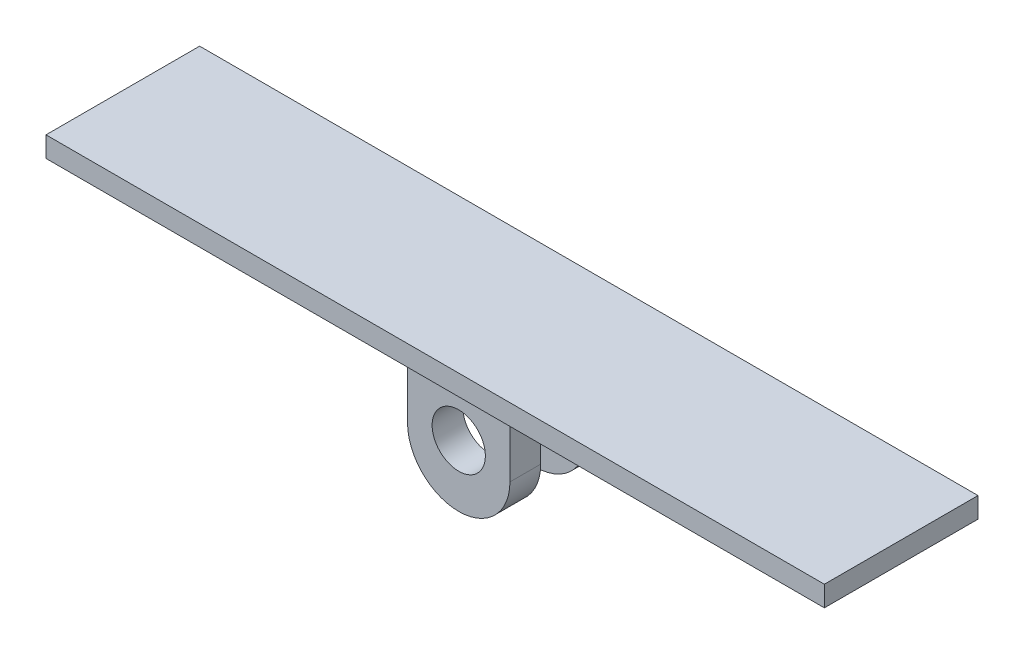
ISO-10303-21;
HEADER;
FILE_DESCRIPTION(('STEP AP214'),'2;1');
FILE_NAME('part.step','',(''),(''),'','','');
FILE_SCHEMA(('AUTOMOTIVE_DESIGN { 1 0 10303 214 1 1 1 1 }'));
ENDSEC;
DATA;
#1=APPLICATION_CONTEXT('core data for automotive mechanical design processes');
#2=APPLICATION_PROTOCOL_DEFINITION('international standard','automotive_design',2000,#1);
#3=PRODUCT_CONTEXT('',#1,'mechanical');
#4=PRODUCT('Part','Part','',(#3));
#5=PRODUCT_RELATED_PRODUCT_CATEGORY('part','',(#4));
#6=PRODUCT_DEFINITION_FORMATION('','',#4);
#7=PRODUCT_DEFINITION_CONTEXT('part definition',#1,'design');
#8=PRODUCT_DEFINITION('design','',#6,#7);
#9=PRODUCT_DEFINITION_SHAPE('','',#8);
#10=(LENGTH_UNIT() NAMED_UNIT(*) SI_UNIT(.MILLI.,.METRE.));
#11=(NAMED_UNIT(*) PLANE_ANGLE_UNIT() SI_UNIT($,.RADIAN.));
#12=(NAMED_UNIT(*) SI_UNIT($,.STERADIAN.) SOLID_ANGLE_UNIT());
#13=UNCERTAINTY_MEASURE_WITH_UNIT(LENGTH_MEASURE(1.E-05),#10,'distance_accuracy_value','');
#14=(GEOMETRIC_REPRESENTATION_CONTEXT(3) GLOBAL_UNCERTAINTY_ASSIGNED_CONTEXT((#13)) GLOBAL_UNIT_ASSIGNED_CONTEXT((#10,
#11,#12)) REPRESENTATION_CONTEXT('',''));
#15=CARTESIAN_POINT('',(0.,0.,0.));
#16=DIRECTION('',(0.,0.,1.));
#17=DIRECTION('',(1.,0.,0.));
#18=AXIS2_PLACEMENT_3D('',#15,#16,#17);
#19=CARTESIAN_POINT('',(-26.6,-1.06140576327071,-12.7528213648522));
#20=DIRECTION('',(0.,-1.,0.));
#21=DIRECTION('',(1.,0.,0.));
#22=AXIS2_PLACEMENT_3D('',#19,#20,#21);
#23=PLANE('',#22);
#24=DIRECTION('',(1.,0.,0.));
#25=VECTOR('',#24,1.);
#26=CARTESIAN_POINT('',(-26.6,-1.06140576327071,-2.25282136485218));
#27=LINE('',#26,#25);
#28=CARTESIAN_POINT('',(-26.6,-1.06140576327071,-2.25282136485218));
#29=VERTEX_POINT('',#28);
#30=CARTESIAN_POINT('',(26.6,-1.0614057632707,-2.25282136485218));
#31=VERTEX_POINT('',#30);
#32=EDGE_CURVE('E215',#29,#31,#27,.T.);
#33=ORIENTED_EDGE('',*,*,#32,.F.);
#34=DIRECTION('',(0.,0.,1.));
#35=VECTOR('',#34,1.);
#36=CARTESIAN_POINT('',(-26.6,-1.06140576327071,-12.7528213648522));
#37=LINE('',#36,#35);
#38=CARTESIAN_POINT('',(-26.6,-1.06140576327071,-12.7528213648522));
#39=VERTEX_POINT('',#38);
#40=EDGE_CURVE('E225',#39,#29,#37,.T.);
#41=ORIENTED_EDGE('',*,*,#40,.F.);
#42=DIRECTION('',(1.,0.,0.));
#43=VECTOR('',#42,1.);
#44=CARTESIAN_POINT('',(-26.6,-1.06140576327071,-12.7528213648522));
#45=LINE('',#44,#43);
#46=CARTESIAN_POINT('',(26.6,-1.0614057632707,-12.7528213648522));
#47=VERTEX_POINT('',#46);
#48=EDGE_CURVE('E203',#39,#47,#45,.T.);
#49=ORIENTED_EDGE('',*,*,#48,.T.);
#50=DIRECTION('',(0.,0.,1.));
#51=VECTOR('',#50,1.);
#52=CARTESIAN_POINT('',(26.6,-1.0614057632707,-12.7528213648522));
#53=LINE('',#52,#51);
#54=EDGE_CURVE('E223',#47,#31,#53,.T.);
#55=ORIENTED_EDGE('',*,*,#54,.T.);
#56=EDGE_LOOP('',(#33,#41,#49,#55));
#57=FACE_BOUND('',#56,.T.);
#58=DIRECTION('',(-1.,0.,0.));
#59=VECTOR('',#58,1.);
#60=CARTESIAN_POINT('',(-3.49999999999999,-1.06140576327071,-9.11282136485218));
#61=LINE('',#60,#59);
#62=CARTESIAN_POINT('',(3.50000000000001,-1.06140576327071,-9.11282136485218));
#63=VERTEX_POINT('',#62);
#64=CARTESIAN_POINT('',(-3.49999999999999,-1.06140576327071,-9.11282136485218));
#65=VERTEX_POINT('',#64);
#66=EDGE_CURVE('E191',#63,#65,#61,.T.);
#67=ORIENTED_EDGE('',*,*,#66,.F.);
#68=DIRECTION('',(0.,0.,1.));
#69=VECTOR('',#68,1.);
#70=CARTESIAN_POINT('',(3.50000000000001,-1.06140576327071,-9.11282136485218));
#71=LINE('',#70,#69);
#72=CARTESIAN_POINT('',(3.50000000000001,-1.06140576327071,-11.2128213648522));
#73=VERTEX_POINT('',#72);
#74=EDGE_CURVE('E162',#73,#63,#71,.T.);
#75=ORIENTED_EDGE('',*,*,#74,.F.);
#76=DIRECTION('',(1.,0.,0.));
#77=VECTOR('',#76,1.);
#78=CARTESIAN_POINT('',(-3.49999999999999,-1.06140576327071,-11.2128213648522));
#79=LINE('',#78,#77);
#80=CARTESIAN_POINT('',(-3.49999999999999,-1.06140576327071,-11.2128213648522));
#81=VERTEX_POINT('',#80);
#82=EDGE_CURVE('E185',#81,#73,#79,.T.);
#83=ORIENTED_EDGE('',*,*,#82,.F.);
#84=DIRECTION('',(0.,0.,-1.));
#85=VECTOR('',#84,1.);
#86=CARTESIAN_POINT('',(-3.49999999999999,-1.06140576327071,-9.11282136485218));
#87=LINE('',#86,#85);
#88=EDGE_CURVE('E188',#65,#81,#87,.T.);
#89=ORIENTED_EDGE('',*,*,#88,.F.);
#90=EDGE_LOOP('',(#67,#75,#83,#89));
#91=FACE_BOUND('',#90,.T.);
#92=DIRECTION('',(-1.,0.,0.));
#93=VECTOR('',#92,1.);
#94=CARTESIAN_POINT('',(-3.49999999999999,-1.06140576327071,-3.86282136485218));
#95=LINE('',#94,#93);
#96=CARTESIAN_POINT('',(3.50000000000001,-1.06140576327071,-3.86282136485218));
#97=VERTEX_POINT('',#96);
#98=CARTESIAN_POINT('',(-3.49999999999999,-1.06140576327071,-3.86282136485218));
#99=VERTEX_POINT('',#98);
#100=EDGE_CURVE('E145',#97,#99,#95,.T.);
#101=ORIENTED_EDGE('',*,*,#100,.F.);
#102=DIRECTION('',(0.,0.,1.));
#103=VECTOR('',#102,1.);
#104=CARTESIAN_POINT('',(3.50000000000001,-1.06140576327071,-3.86282136485218));
#105=LINE('',#104,#103);
#106=CARTESIAN_POINT('',(3.5,-1.06140576327071,-5.96282136485218));
#107=VERTEX_POINT('',#106);
#108=EDGE_CURVE('E156',#107,#97,#105,.T.);
#109=ORIENTED_EDGE('',*,*,#108,.F.);
#110=DIRECTION('',(1.,0.,0.));
#111=VECTOR('',#110,1.);
#112=CARTESIAN_POINT('',(-3.5,-1.06140576327071,-5.96282136485218));
#113=LINE('',#112,#111);
#114=CARTESIAN_POINT('',(-3.5,-1.06140576327071,-5.96282136485218));
#115=VERTEX_POINT('',#114);
#116=EDGE_CURVE('E167',#115,#107,#113,.T.);
#117=ORIENTED_EDGE('',*,*,#116,.F.);
#118=DIRECTION('',(0.,0.,-1.));
#119=VECTOR('',#118,1.);
#120=CARTESIAN_POINT('',(-3.49999999999999,-1.06140576327071,-3.86282136485218));
#121=LINE('',#120,#119);
#122=EDGE_CURVE('E165',#99,#115,#121,.T.);
#123=ORIENTED_EDGE('',*,*,#122,.F.);
#124=EDGE_LOOP('',(#101,#109,#117,#123));
#125=FACE_BOUND('',#124,.T.);
#126=ADVANCED_FACE('F41',(#57,#91,#125),#23,.T.);
#127=CARTESIAN_POINT('',(-26.6,0.338594236729289,-12.7528213648522));
#128=DIRECTION('',(0.,1.,0.));
#129=DIRECTION('',(-1.,0.,0.));
#130=AXIS2_PLACEMENT_3D('',#127,#128,#129);
#131=PLANE('',#130);
#132=DIRECTION('',(-1.,0.,0.));
#133=VECTOR('',#132,1.);
#134=CARTESIAN_POINT('',(-26.6,0.338594236729289,-2.25282136485218));
#135=LINE('',#134,#133);
#136=CARTESIAN_POINT('',(26.6,0.338594236729295,-2.25282136485218));
#137=VERTEX_POINT('',#136);
#138=CARTESIAN_POINT('',(-26.6,0.338594236729289,-2.25282136485218));
#139=VERTEX_POINT('',#138);
#140=EDGE_CURVE('E152',#137,#139,#135,.T.);
#141=ORIENTED_EDGE('',*,*,#140,.F.);
#142=DIRECTION('',(0.,0.,1.));
#143=VECTOR('',#142,1.);
#144=CARTESIAN_POINT('',(26.6,0.338594236729295,-12.7528213648522));
#145=LINE('',#144,#143);
#146=CARTESIAN_POINT('',(26.6,0.338594236729295,-12.7528213648522));
#147=VERTEX_POINT('',#146);
#148=EDGE_CURVE('E220',#147,#137,#145,.T.);
#149=ORIENTED_EDGE('',*,*,#148,.F.);
#150=DIRECTION('',(-1.,0.,0.));
#151=VECTOR('',#150,1.);
#152=CARTESIAN_POINT('',(-26.6,0.338594236729289,-12.7528213648522));
#153=LINE('',#152,#151);
#154=CARTESIAN_POINT('',(-26.6,0.338594236729289,-12.7528213648522));
#155=VERTEX_POINT('',#154);
#156=EDGE_CURVE('E196',#147,#155,#153,.T.);
#157=ORIENTED_EDGE('',*,*,#156,.T.);
#158=DIRECTION('',(0.,0.,1.));
#159=VECTOR('',#158,1.);
#160=CARTESIAN_POINT('',(-26.6,0.338594236729289,-12.7528213648522));
#161=LINE('',#160,#159);
#162=EDGE_CURVE('E209',#155,#139,#161,.T.);
#163=ORIENTED_EDGE('',*,*,#162,.T.);
#164=EDGE_LOOP('',(#141,#149,#157,#163));
#165=FACE_BOUND('',#164,.T.);
#166=ADVANCED_FACE('F281',(#165),#131,.T.);
#167=CARTESIAN_POINT('',(26.6,-1.0614057632707,-12.7528213648522));
#168=DIRECTION('',(1.,0.,0.));
#169=DIRECTION('',(0.,0.,-1.));
#170=AXIS2_PLACEMENT_3D('',#167,#168,#169);
#171=PLANE('',#170);
#172=DIRECTION('',(0.,1.,0.));
#173=VECTOR('',#172,1.);
#174=CARTESIAN_POINT('',(26.6,-1.0614057632707,-2.25282136485218));
#175=LINE('',#174,#173);
#176=EDGE_CURVE('E200',#31,#137,#175,.T.);
#177=ORIENTED_EDGE('',*,*,#176,.F.);
#178=ORIENTED_EDGE('',*,*,#54,.F.);
#179=DIRECTION('',(0.,1.,0.));
#180=VECTOR('',#179,1.);
#181=CARTESIAN_POINT('',(26.6,-1.0614057632707,-12.7528213648522));
#182=LINE('',#181,#180);
#183=EDGE_CURVE('E206',#47,#147,#182,.T.);
#184=ORIENTED_EDGE('',*,*,#183,.T.);
#185=ORIENTED_EDGE('',*,*,#148,.T.);
#186=EDGE_LOOP('',(#177,#178,#184,#185));
#187=FACE_BOUND('',#186,.T.);
#188=ADVANCED_FACE('F287',(#187),#171,.T.);
#189=CARTESIAN_POINT('',(-26.6,-1.06140576327071,-12.7528213648522));
#190=DIRECTION('',(-1.,0.,0.));
#191=DIRECTION('',(0.,0.,1.));
#192=AXIS2_PLACEMENT_3D('',#189,#190,#191);
#193=PLANE('',#192);
#194=DIRECTION('',(0.,-1.,0.));
#195=VECTOR('',#194,1.);
#196=CARTESIAN_POINT('',(-26.6,-1.06140576327071,-2.25282136485218));
#197=LINE('',#196,#195);
#198=EDGE_CURVE('E212',#139,#29,#197,.T.);
#199=ORIENTED_EDGE('',*,*,#198,.F.);
#200=ORIENTED_EDGE('',*,*,#162,.F.);
#201=DIRECTION('',(0.,-1.,0.));
#202=VECTOR('',#201,1.);
#203=CARTESIAN_POINT('',(-26.6,-1.06140576327071,-12.7528213648522));
#204=LINE('',#203,#202);
#205=EDGE_CURVE('E199',#155,#39,#204,.T.);
#206=ORIENTED_EDGE('',*,*,#205,.T.);
#207=ORIENTED_EDGE('',*,*,#40,.T.);
#208=EDGE_LOOP('',(#199,#200,#206,#207));
#209=FACE_BOUND('',#208,.T.);
#210=ADVANCED_FACE('F295',(#209),#193,.T.);
#211=CARTESIAN_POINT('',(0.,-0.361405763270708,-12.7528213648522));
#212=DIRECTION('',(0.,0.,1.));
#213=DIRECTION('',(1.,0.,0.));
#214=AXIS2_PLACEMENT_3D('',#211,#212,#213);
#215=PLANE('',#214);
#216=ORIENTED_EDGE('',*,*,#156,.F.);
#217=ORIENTED_EDGE('',*,*,#183,.F.);
#218=ORIENTED_EDGE('',*,*,#48,.F.);
#219=ORIENTED_EDGE('',*,*,#205,.F.);
#220=EDGE_LOOP('',(#216,#217,#218,#219));
#221=FACE_BOUND('',#220,.T.);
#222=ADVANCED_FACE('F297',(#221),#215,.F.);
#223=CARTESIAN_POINT('',(0.,-0.361405763270708,-2.25282136485218));
#224=DIRECTION('',(0.,0.,1.));
#225=DIRECTION('',(1.,0.,0.));
#226=AXIS2_PLACEMENT_3D('',#223,#224,#225);
#227=PLANE('',#226);
#228=ORIENTED_EDGE('',*,*,#140,.T.);
#229=ORIENTED_EDGE('',*,*,#198,.T.);
#230=ORIENTED_EDGE('',*,*,#32,.T.);
#231=ORIENTED_EDGE('',*,*,#176,.T.);
#232=EDGE_LOOP('',(#228,#229,#230,#231));
#233=FACE_BOUND('',#232,.T.);
#234=ADVANCED_FACE('F401',(#233),#227,.T.);
#235=CARTESIAN_POINT('',(3.50000000000001,-9.46140576327071,-9.11282136485218));
#236=DIRECTION('',(-1.,0.,0.));
#237=DIRECTION('',(0.,0.,1.));
#238=AXIS2_PLACEMENT_3D('',#235,#236,#237);
#239=PLANE('',#238);
#240=DIRECTION('',(0.,1.,0.));
#241=VECTOR('',#240,1.);
#242=CARTESIAN_POINT('',(3.50000000000001,-9.46140576327071,-9.11282136485218));
#243=LINE('',#242,#241);
#244=CARTESIAN_POINT('',(3.50000000000001,-5.96140576327071,-9.11282136485218));
#245=VERTEX_POINT('',#244);
#246=EDGE_CURVE('E176',#245,#63,#243,.T.);
#247=ORIENTED_EDGE('',*,*,#246,.F.);
#248=DIRECTION('',(0.,0.,1.));
#249=VECTOR('',#248,1.);
#250=CARTESIAN_POINT('',(3.50000000000001,-5.96140576327071,-11.2128213648522));
#251=LINE('',#250,#249);
#252=CARTESIAN_POINT('',(3.50000000000001,-5.96140576327071,-11.2128213648522));
#253=VERTEX_POINT('',#252);
#254=EDGE_CURVE('E243',#245,#253,#251,.F.);
#255=ORIENTED_EDGE('',*,*,#254,.T.);
#256=DIRECTION('',(0.,1.,0.));
#257=VECTOR('',#256,1.);
#258=CARTESIAN_POINT('',(3.50000000000001,-9.46140576327071,-11.2128213648522));
#259=LINE('',#258,#257);
#260=EDGE_CURVE('E183',#253,#73,#259,.T.);
#261=ORIENTED_EDGE('',*,*,#260,.T.);
#262=ORIENTED_EDGE('',*,*,#74,.T.);
#263=EDGE_LOOP('',(#247,#255,#261,#262));
#264=FACE_BOUND('',#263,.T.);
#265=ADVANCED_FACE('F392',(#264),#239,.F.);
#266=CARTESIAN_POINT('',(-3.49999999999999,-9.46140576327071,-9.11282136485218));
#267=DIRECTION('',(0.,0.,-1.));
#268=DIRECTION('',(-1.,0.,0.));
#269=AXIS2_PLACEMENT_3D('',#266,#267,#268);
#270=PLANE('',#269);
#271=CARTESIAN_POINT('',(0.,-5.26140576327071,-9.11282136485218));
#272=DIRECTION('',(0.,0.,-1.));
#273=DIRECTION('',(-1.,0.,0.));
#274=AXIS2_PLACEMENT_3D('',#271,#272,#273);
#275=CIRCLE('',#274,1.82);
#276=CARTESIAN_POINT('',(-1.81999999999999,-5.26140576327071,-9.11282136485218));
#277=VERTEX_POINT('',#276);
#278=EDGE_CURVE('E179',#277,#277,#275,.T.);
#279=ORIENTED_EDGE('',*,*,#278,.T.);
#280=EDGE_LOOP('',(#279));
#281=FACE_BOUND('',#280,.T.);
#282=DIRECTION('',(0.,1.,0.));
#283=VECTOR('',#282,1.);
#284=CARTESIAN_POINT('',(-3.49999999999999,-9.46140576327071,-9.11282136485218));
#285=LINE('',#284,#283);
#286=CARTESIAN_POINT('',(-3.49999999999999,-5.96140576327071,-9.11282136485218));
#287=VERTEX_POINT('',#286);
#288=EDGE_CURVE('E178',#287,#65,#285,.T.);
#289=ORIENTED_EDGE('',*,*,#288,.F.);
#290=CARTESIAN_POINT('',(0.,-5.96140576327071,-9.11282136485218));
#291=DIRECTION('',(0.,0.,-1.));
#292=DIRECTION('',(-1.,0.,0.));
#293=AXIS2_PLACEMENT_3D('',#290,#291,#292);
#294=CIRCLE('',#293,3.5);
#295=CARTESIAN_POINT('',(0.,-9.46140576327071,-9.11282136485218));
#296=VERTEX_POINT('',#295);
#297=EDGE_CURVE('E241',#287,#296,#294,.F.);
#298=ORIENTED_EDGE('',*,*,#297,.T.);
#299=CARTESIAN_POINT('',(0.,-5.96140576327071,-9.11282136485218));
#300=DIRECTION('',(0.,0.,-1.));
#301=DIRECTION('',(-1.,0.,0.));
#302=AXIS2_PLACEMENT_3D('',#299,#300,#301);
#303=CIRCLE('',#302,3.5);
#304=EDGE_CURVE('E239',#296,#245,#303,.F.);
#305=ORIENTED_EDGE('',*,*,#304,.T.);
#306=ORIENTED_EDGE('',*,*,#246,.T.);
#307=ORIENTED_EDGE('',*,*,#66,.T.);
#308=EDGE_LOOP('',(#289,#298,#305,#306,#307));
#309=FACE_BOUND('',#308,.T.);
#310=ADVANCED_FACE('F382',(#281,#309),#270,.F.);
#311=CARTESIAN_POINT('',(-3.49999999999999,-9.46140576327071,-9.11282136485218));
#312=DIRECTION('',(1.,0.,0.));
#313=DIRECTION('',(0.,1.,0.));
#314=AXIS2_PLACEMENT_3D('',#311,#312,#313);
#315=PLANE('',#314);
#316=DIRECTION('',(0.,1.,0.));
#317=VECTOR('',#316,1.);
#318=CARTESIAN_POINT('',(-3.49999999999999,-9.46140576327071,-11.2128213648522));
#319=LINE('',#318,#317);
#320=CARTESIAN_POINT('',(-3.49999999999999,-5.96140576327071,-11.2128213648522));
#321=VERTEX_POINT('',#320);
#322=EDGE_CURVE('E181',#321,#81,#319,.T.);
#323=ORIENTED_EDGE('',*,*,#322,.F.);
#324=DIRECTION('',(0.,0.,-1.));
#325=VECTOR('',#324,1.);
#326=CARTESIAN_POINT('',(-3.49999999999999,-5.96140576327071,-9.11282136485218));
#327=LINE('',#326,#325);
#328=EDGE_CURVE('E236',#321,#287,#327,.F.);
#329=ORIENTED_EDGE('',*,*,#328,.T.);
#330=ORIENTED_EDGE('',*,*,#288,.T.);
#331=ORIENTED_EDGE('',*,*,#88,.T.);
#332=EDGE_LOOP('',(#323,#329,#330,#331));
#333=FACE_BOUND('',#332,.T.);
#334=ADVANCED_FACE('F372',(#333),#315,.F.);
#335=CARTESIAN_POINT('',(-3.49999999999999,-9.46140576327071,-11.2128213648522));
#336=DIRECTION('',(0.,0.,1.));
#337=DIRECTION('',(1.,0.,0.));
#338=AXIS2_PLACEMENT_3D('',#335,#336,#337);
#339=PLANE('',#338);
#340=CARTESIAN_POINT('',(0.,-5.26140576327071,-11.2128213648522));
#341=DIRECTION('',(0.,0.,1.));
#342=DIRECTION('',(1.,0.,0.));
#343=AXIS2_PLACEMENT_3D('',#340,#341,#342);
#344=CIRCLE('',#343,1.82);
#345=CARTESIAN_POINT('',(1.82000000000001,-5.26140576327071,-11.2128213648522));
#346=VERTEX_POINT('',#345);
#347=EDGE_CURVE('E231',#346,#346,#344,.T.);
#348=ORIENTED_EDGE('',*,*,#347,.T.);
#349=EDGE_LOOP('',(#348));
#350=FACE_BOUND('',#349,.T.);
#351=CARTESIAN_POINT('',(0.,-5.96140576327071,-11.2128213648522));
#352=DIRECTION('',(0.,0.,1.));
#353=DIRECTION('',(1.,0.,0.));
#354=AXIS2_PLACEMENT_3D('',#351,#352,#353);
#355=CIRCLE('',#354,3.5);
#356=CARTESIAN_POINT('',(0.,-9.46140576327071,-11.2128213648522));
#357=VERTEX_POINT('',#356);
#358=EDGE_CURVE('E222',#253,#357,#355,.F.);
#359=ORIENTED_EDGE('',*,*,#358,.T.);
#360=CARTESIAN_POINT('',(0.,-5.96140576327071,-11.2128213648522));
#361=DIRECTION('',(0.,0.,1.));
#362=DIRECTION('',(1.,0.,0.));
#363=AXIS2_PLACEMENT_3D('',#360,#361,#362);
#364=CIRCLE('',#363,3.5);
#365=EDGE_CURVE('E234',#357,#321,#364,.F.);
#366=ORIENTED_EDGE('',*,*,#365,.T.);
#367=ORIENTED_EDGE('',*,*,#322,.T.);
#368=ORIENTED_EDGE('',*,*,#82,.T.);
#369=ORIENTED_EDGE('',*,*,#260,.F.);
#370=EDGE_LOOP('',(#359,#366,#367,#368,#369));
#371=FACE_BOUND('',#370,.T.);
#372=ADVANCED_FACE('F363',(#350,#371),#339,.F.);
#373=CARTESIAN_POINT('',(3.50000000000001,-9.46140576327071,-3.86282136485218));
#374=DIRECTION('',(-1.,0.,0.));
#375=DIRECTION('',(0.,0.,1.));
#376=AXIS2_PLACEMENT_3D('',#373,#374,#375);
#377=PLANE('',#376);
#378=DIRECTION('',(0.,1.,0.));
#379=VECTOR('',#378,1.);
#380=CARTESIAN_POINT('',(3.50000000000001,-9.46140576327071,-3.86282136485218));
#381=LINE('',#380,#379);
#382=CARTESIAN_POINT('',(3.50000000000001,-5.96140576327071,-3.86282136485218));
#383=VERTEX_POINT('',#382);
#384=EDGE_CURVE('E140',#383,#97,#381,.T.);
#385=ORIENTED_EDGE('',*,*,#384,.F.);
#386=DIRECTION('',(0.,0.,1.));
#387=VECTOR('',#386,1.);
#388=CARTESIAN_POINT('',(3.5,-5.96140576327071,-5.96282136485218));
#389=LINE('',#388,#387);
#390=CARTESIAN_POINT('',(3.5,-5.96140576327071,-5.96282136485218));
#391=VERTEX_POINT('',#390);
#392=EDGE_CURVE('E248',#383,#391,#389,.F.);
#393=ORIENTED_EDGE('',*,*,#392,.T.);
#394=DIRECTION('',(0.,1.,0.));
#395=VECTOR('',#394,1.);
#396=CARTESIAN_POINT('',(3.5,-9.46140576327071,-5.96282136485218));
#397=LINE('',#396,#395);
#398=EDGE_CURVE('E158',#391,#107,#397,.T.);
#399=ORIENTED_EDGE('',*,*,#398,.T.);
#400=ORIENTED_EDGE('',*,*,#108,.T.);
#401=EDGE_LOOP('',(#385,#393,#399,#400));
#402=FACE_BOUND('',#401,.T.);
#403=ADVANCED_FACE('F157',(#402),#377,.F.);
#404=CARTESIAN_POINT('',(-3.49999999999999,-9.46140576327071,-3.86282136485218));
#405=DIRECTION('',(0.,0.,-1.));
#406=DIRECTION('',(-1.,0.,0.));
#407=AXIS2_PLACEMENT_3D('',#404,#405,#406);
#408=PLANE('',#407);
#409=CARTESIAN_POINT('',(0.,-5.26140576327071,-3.86282136485218));
#410=DIRECTION('',(0.,0.,1.));
#411=DIRECTION('',(1.,0.,0.));
#412=AXIS2_PLACEMENT_3D('',#409,#410,#411);
#413=CIRCLE('',#412,1.82);
#414=CARTESIAN_POINT('',(1.82000000000001,-5.26140576327071,-3.86282136485218));
#415=VERTEX_POINT('',#414);
#416=EDGE_CURVE('E232',#415,#415,#413,.T.);
#417=ORIENTED_EDGE('',*,*,#416,.F.);
#418=EDGE_LOOP('',(#417));
#419=FACE_BOUND('',#418,.T.);
#420=CARTESIAN_POINT('',(0.,-5.96140576327071,-3.86282136485218));
#421=DIRECTION('',(0.,0.,-1.));
#422=DIRECTION('',(-1.,0.,0.));
#423=AXIS2_PLACEMENT_3D('',#420,#421,#422);
#424=CIRCLE('',#423,3.5);
#425=CARTESIAN_POINT('',(-3.49999999999999,-5.96140576327071,-3.86282136485218));
#426=VERTEX_POINT('',#425);
#427=CARTESIAN_POINT('',(0.,-9.46140576327071,-3.86282136485218));
#428=VERTEX_POINT('',#427);
#429=EDGE_CURVE('E245',#426,#428,#424,.F.);
#430=ORIENTED_EDGE('',*,*,#429,.T.);
#431=CARTESIAN_POINT('',(0.,-5.96140576327071,-3.86282136485218));
#432=DIRECTION('',(0.,0.,-1.));
#433=DIRECTION('',(-1.,0.,0.));
#434=AXIS2_PLACEMENT_3D('',#431,#432,#433);
#435=CIRCLE('',#434,3.5);
#436=EDGE_CURVE('E148',#428,#383,#435,.F.);
#437=ORIENTED_EDGE('',*,*,#436,.T.);
#438=ORIENTED_EDGE('',*,*,#384,.T.);
#439=ORIENTED_EDGE('',*,*,#100,.T.);
#440=DIRECTION('',(0.,1.,0.));
#441=VECTOR('',#440,1.);
#442=CARTESIAN_POINT('',(-3.49999999999999,-9.46140576327071,-3.86282136485218));
#443=LINE('',#442,#441);
#444=EDGE_CURVE('E153',#426,#99,#443,.T.);
#445=ORIENTED_EDGE('',*,*,#444,.F.);
#446=EDGE_LOOP('',(#430,#437,#438,#439,#445));
#447=FACE_BOUND('',#446,.T.);
#448=ADVANCED_FACE('F142',(#419,#447),#408,.F.);
#449=CARTESIAN_POINT('',(-3.49999999999999,-9.46140576327071,-3.86282136485218));
#450=DIRECTION('',(1.,0.,0.));
#451=DIRECTION('',(0.,0.,-1.));
#452=AXIS2_PLACEMENT_3D('',#449,#450,#451);
#453=PLANE('',#452);
#454=DIRECTION('',(0.,1.,0.));
#455=VECTOR('',#454,1.);
#456=CARTESIAN_POINT('',(-3.5,-9.46140576327071,-5.96282136485218));
#457=LINE('',#456,#455);
#458=CARTESIAN_POINT('',(-3.5,-5.96140576327071,-5.96282136485218));
#459=VERTEX_POINT('',#458);
#460=EDGE_CURVE('E173',#459,#115,#457,.T.);
#461=ORIENTED_EDGE('',*,*,#460,.F.);
#462=DIRECTION('',(0.,0.,-1.));
#463=VECTOR('',#462,1.);
#464=CARTESIAN_POINT('',(-3.49999999999999,-5.96140576327071,-3.86282136485218));
#465=LINE('',#464,#463);
#466=EDGE_CURVE('E12',#459,#426,#465,.F.);
#467=ORIENTED_EDGE('',*,*,#466,.T.);
#468=ORIENTED_EDGE('',*,*,#444,.T.);
#469=ORIENTED_EDGE('',*,*,#122,.T.);
#470=EDGE_LOOP('',(#461,#467,#468,#469));
#471=FACE_BOUND('',#470,.T.);
#472=ADVANCED_FACE('F266',(#471),#453,.F.);
#473=CARTESIAN_POINT('',(-3.5,-9.46140576327071,-5.96282136485218));
#474=DIRECTION('',(0.,0.,1.));
#475=DIRECTION('',(1.,0.,0.));
#476=AXIS2_PLACEMENT_3D('',#473,#474,#475);
#477=PLANE('',#476);
#478=CARTESIAN_POINT('',(0.,-5.26140576327071,-5.96282136485218));
#479=DIRECTION('',(0.,0.,1.));
#480=DIRECTION('',(1.,0.,0.));
#481=AXIS2_PLACEMENT_3D('',#478,#479,#480);
#482=CIRCLE('',#481,1.82);
#483=CARTESIAN_POINT('',(1.82000000000001,-5.26140576327071,-5.96282136485218));
#484=VERTEX_POINT('',#483);
#485=EDGE_CURVE('E228',#484,#484,#482,.T.);
#486=ORIENTED_EDGE('',*,*,#485,.T.);
#487=EDGE_LOOP('',(#486));
#488=FACE_BOUND('',#487,.T.);
#489=ORIENTED_EDGE('',*,*,#398,.F.);
#490=CARTESIAN_POINT('',(0.,-5.96140576327071,-5.96282136485218));
#491=DIRECTION('',(0.,0.,1.));
#492=DIRECTION('',(1.,0.,0.));
#493=AXIS2_PLACEMENT_3D('',#490,#491,#492);
#494=CIRCLE('',#493,3.5);
#495=CARTESIAN_POINT('',(0.,-9.46140576327071,-5.96282136485218));
#496=VERTEX_POINT('',#495);
#497=EDGE_CURVE('E50',#391,#496,#494,.F.);
#498=ORIENTED_EDGE('',*,*,#497,.T.);
#499=CARTESIAN_POINT('',(0.,-5.96140576327071,-5.96282136485218));
#500=DIRECTION('',(0.,0.,1.));
#501=DIRECTION('',(1.,0.,0.));
#502=AXIS2_PLACEMENT_3D('',#499,#500,#501);
#503=CIRCLE('',#502,3.5);
#504=EDGE_CURVE('E58',#496,#459,#503,.F.);
#505=ORIENTED_EDGE('',*,*,#504,.T.);
#506=ORIENTED_EDGE('',*,*,#460,.T.);
#507=ORIENTED_EDGE('',*,*,#116,.T.);
#508=EDGE_LOOP('',(#489,#498,#505,#506,#507));
#509=FACE_BOUND('',#508,.T.);
#510=ADVANCED_FACE('F267',(#488,#509),#477,.F.);
#511=CARTESIAN_POINT('',(0.,-5.26140576327071,-12.2628213648522));
#512=DIRECTION('',(0.,0.,1.));
#513=DIRECTION('',(1.,0.,0.));
#514=AXIS2_PLACEMENT_3D('',#511,#512,#513);
#515=CYLINDRICAL_SURFACE('',#514,1.82);
#516=ORIENTED_EDGE('',*,*,#416,.T.);
#517=EDGE_LOOP('',(#516));
#518=FACE_BOUND('',#517,.T.);
#519=ORIENTED_EDGE('',*,*,#485,.F.);
#520=EDGE_LOOP('',(#519));
#521=FACE_BOUND('',#520,.T.);
#522=ADVANCED_FACE('F269',(#518,#521),#515,.F.);
#523=ORIENTED_EDGE('',*,*,#347,.F.);
#524=EDGE_LOOP('',(#523));
#525=FACE_BOUND('',#524,.T.);
#526=ORIENTED_EDGE('',*,*,#278,.F.);
#527=EDGE_LOOP('',(#526));
#528=FACE_BOUND('',#527,.T.);
#529=ADVANCED_FACE('F276',(#525,#528),#515,.F.);
#530=CARTESIAN_POINT('',(0.,-5.96140576327071,-2.25282136485218));
#531=DIRECTION('',(0.,0.,-1.));
#532=DIRECTION('',(-1.,0.,0.));
#533=AXIS2_PLACEMENT_3D('',#530,#531,#532);
#534=CYLINDRICAL_SURFACE('',#533,3.5);
#535=ORIENTED_EDGE('',*,*,#254,.F.);
#536=ORIENTED_EDGE('',*,*,#304,.F.);
#537=DIRECTION('',(0.,0.,1.));
#538=VECTOR('',#537,1.);
#539=CARTESIAN_POINT('',(0.,-9.46140576327071,-9.11282136485218));
#540=LINE('',#539,#538);
#541=EDGE_CURVE('E251',#357,#296,#540,.T.);
#542=ORIENTED_EDGE('',*,*,#541,.F.);
#543=ORIENTED_EDGE('',*,*,#358,.F.);
#544=EDGE_LOOP('',(#535,#536,#542,#543));
#545=FACE_BOUND('',#544,.T.);
#546=ADVANCED_FACE('F303',(#545),#534,.T.);
#547=CARTESIAN_POINT('',(0.,-5.96140576327071,-2.25282136485218));
#548=DIRECTION('',(0.,0.,1.));
#549=DIRECTION('',(0.,-1.,0.));
#550=AXIS2_PLACEMENT_3D('',#547,#548,#549);
#551=CYLINDRICAL_SURFACE('',#550,3.5);
#552=ORIENTED_EDGE('',*,*,#297,.F.);
#553=ORIENTED_EDGE('',*,*,#328,.F.);
#554=ORIENTED_EDGE('',*,*,#365,.F.);
#555=ORIENTED_EDGE('',*,*,#541,.T.);
#556=EDGE_LOOP('',(#552,#553,#554,#555));
#557=FACE_BOUND('',#556,.T.);
#558=ADVANCED_FACE('F300',(#557),#551,.T.);
#559=CARTESIAN_POINT('',(0.,-5.96140576327071,-2.25282136485218));
#560=DIRECTION('',(0.,0.,1.));
#561=DIRECTION('',(1.,0.,0.));
#562=AXIS2_PLACEMENT_3D('',#559,#560,#561);
#563=CYLINDRICAL_SURFACE('',#562,3.5);
#564=ORIENTED_EDGE('',*,*,#466,.F.);
#565=ORIENTED_EDGE('',*,*,#504,.F.);
#566=DIRECTION('',(0.,0.,-1.));
#567=VECTOR('',#566,1.);
#568=CARTESIAN_POINT('',(0.,-9.46140576327071,-5.96282136485218));
#569=LINE('',#568,#567);
#570=EDGE_CURVE('E45',#428,#496,#569,.T.);
#571=ORIENTED_EDGE('',*,*,#570,.F.);
#572=ORIENTED_EDGE('',*,*,#429,.F.);
#573=EDGE_LOOP('',(#564,#565,#571,#572));
#574=FACE_BOUND('',#573,.T.);
#575=ADVANCED_FACE('F43',(#574),#563,.T.);
#576=CARTESIAN_POINT('',(0.,-5.96140576327071,-2.25282136485218));
#577=DIRECTION('',(0.,0.,-1.));
#578=DIRECTION('',(-1.,0.,0.));
#579=AXIS2_PLACEMENT_3D('',#576,#577,#578);
#580=CYLINDRICAL_SURFACE('',#579,3.5);
#581=ORIENTED_EDGE('',*,*,#497,.F.);
#582=ORIENTED_EDGE('',*,*,#392,.F.);
#583=ORIENTED_EDGE('',*,*,#436,.F.);
#584=ORIENTED_EDGE('',*,*,#570,.T.);
#585=EDGE_LOOP('',(#581,#582,#583,#584));
#586=FACE_BOUND('',#585,.T.);
#587=ADVANCED_FACE('F261',(#586),#580,.T.);
#588=CLOSED_SHELL('',(#126,#166,#188,#210,#222,#234,#265,#310,#334,#372,#403,#448,#472,#510,
#522,#529,#546,#558,#575,#587));
#589=MANIFOLD_SOLID_BREP('B2',#588);
#590=ADVANCED_BREP_SHAPE_REPRESENTATION('',(#18,#589),#14);
#591=SHAPE_DEFINITION_REPRESENTATION(#9,#590);
ENDSEC;
END-ISO-10303-21;
